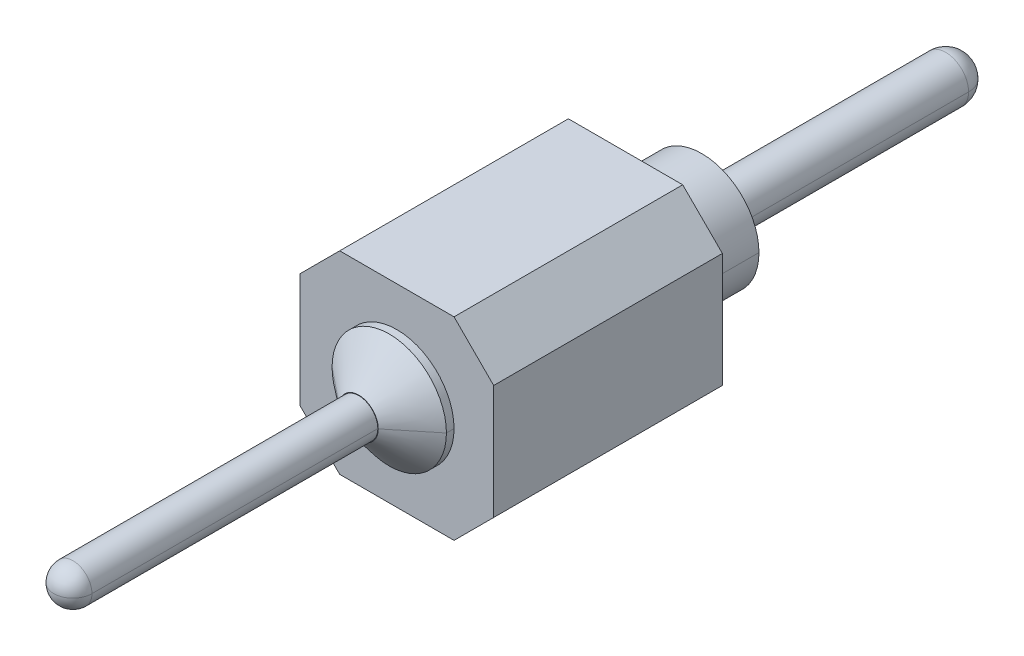
ISO-10303-21;
HEADER;
FILE_DESCRIPTION(('STEP AP214'),'2;1');
FILE_NAME('part.step','',(''),(''),'','','');
FILE_SCHEMA(('AUTOMOTIVE_DESIGN { 1 0 10303 214 1 1 1 1 }'));
ENDSEC;
DATA;
#1=APPLICATION_CONTEXT('core data for automotive mechanical design processes');
#2=APPLICATION_PROTOCOL_DEFINITION('international standard','automotive_design',2000,#1);
#3=PRODUCT_CONTEXT('',#1,'mechanical');
#4=PRODUCT('Part','Part','',(#3));
#5=PRODUCT_RELATED_PRODUCT_CATEGORY('part','',(#4));
#6=PRODUCT_DEFINITION_FORMATION('','',#4);
#7=PRODUCT_DEFINITION_CONTEXT('part definition',#1,'design');
#8=PRODUCT_DEFINITION('design','',#6,#7);
#9=PRODUCT_DEFINITION_SHAPE('','',#8);
#10=(LENGTH_UNIT() NAMED_UNIT(*) SI_UNIT(.MILLI.,.METRE.));
#11=(NAMED_UNIT(*) PLANE_ANGLE_UNIT() SI_UNIT($,.RADIAN.));
#12=(NAMED_UNIT(*) SI_UNIT($,.STERADIAN.) SOLID_ANGLE_UNIT());
#13=UNCERTAINTY_MEASURE_WITH_UNIT(LENGTH_MEASURE(1.E-05),#10,'distance_accuracy_value','');
#14=(GEOMETRIC_REPRESENTATION_CONTEXT(3) GLOBAL_UNCERTAINTY_ASSIGNED_CONTEXT((#13)) GLOBAL_UNIT_ASSIGNED_CONTEXT((#10,
#11,#12)) REPRESENTATION_CONTEXT('',''));
#15=CARTESIAN_POINT('',(0.,0.,0.));
#16=DIRECTION('',(0.,0.,1.));
#17=DIRECTION('',(1.,0.,0.));
#18=AXIS2_PLACEMENT_3D('',#15,#16,#17);
#19=CARTESIAN_POINT('',(0.,0.,0.5));
#20=DIRECTION('',(0.,0.,1.));
#21=DIRECTION('',(1.,0.,0.));
#22=AXIS2_PLACEMENT_3D('',#19,#20,#21);
#23=PLANE('',#22);
#24=CARTESIAN_POINT('',(0.,0.,0.5));
#25=DIRECTION('',(0.,0.,1.));
#26=DIRECTION('',(1.,0.,0.));
#27=AXIS2_PLACEMENT_3D('',#24,#25,#26);
#28=CIRCLE('',#27,0.256041137386);
#29=CARTESIAN_POINT('',(0.256041137386,0.,0.5));
#30=VERTEX_POINT('',#29);
#31=CARTESIAN_POINT('',(-0.256041137386,0.,0.5));
#32=VERTEX_POINT('',#31);
#33=EDGE_CURVE('E11',#30,#32,#28,.T.);
#34=ORIENTED_EDGE('',*,*,#33,.T.);
#35=CARTESIAN_POINT('',(0.,0.,0.5));
#36=DIRECTION('',(0.,0.,1.));
#37=DIRECTION('',(1.,0.,0.));
#38=AXIS2_PLACEMENT_3D('',#35,#36,#37);
#39=CIRCLE('',#38,0.256041137386);
#40=EDGE_CURVE('E263',#32,#30,#39,.T.);
#41=ORIENTED_EDGE('',*,*,#40,.T.);
#42=EDGE_LOOP('',(#34,#41));
#43=FACE_BOUND('',#42,.T.);
#44=CARTESIAN_POINT('',(0.,0.,0.5));
#45=DIRECTION('',(0.,0.,1.));
#46=DIRECTION('',(1.,0.,0.));
#47=AXIS2_PLACEMENT_3D('',#44,#45,#46);
#48=CIRCLE('',#47,0.25);
#49=CARTESIAN_POINT('',(0.25,0.,0.5));
#50=VERTEX_POINT('',#49);
#51=CARTESIAN_POINT('',(-0.25,0.,0.5));
#52=VERTEX_POINT('',#51);
#53=EDGE_CURVE('E28',#50,#52,#48,.T.);
#54=ORIENTED_EDGE('',*,*,#53,.F.);
#55=CARTESIAN_POINT('',(0.,0.,0.5));
#56=DIRECTION('',(0.,0.,1.));
#57=DIRECTION('',(1.,0.,0.));
#58=AXIS2_PLACEMENT_3D('',#55,#56,#57);
#59=CIRCLE('',#58,0.25);
#60=EDGE_CURVE('E340',#52,#50,#59,.T.);
#61=ORIENTED_EDGE('',*,*,#60,.F.);
#62=EDGE_LOOP('',(#54,#61));
#63=FACE_BOUND('',#62,.T.);
#64=ADVANCED_FACE('F17',(#43,#63),#23,.T.);
#65=CARTESIAN_POINT('',(0.,0.,0.1));
#66=DIRECTION('',(0.,0.,-1.));
#67=DIRECTION('',(1.,0.,0.));
#68=AXIS2_PLACEMENT_3D('',#65,#66,#67);
#69=CONICAL_SURFACE('',#68,0.75,0.890117918517);
#70=DIRECTION('',(-0.777145961456903,0.,-0.629320391049922));
#71=VECTOR('',#70,1.);
#72=CARTESIAN_POINT('',(-0.75,0.,0.1));
#73=LINE('',#72,#71);
#74=CARTESIAN_POINT('',(-0.75,0.,0.1));
#75=VERTEX_POINT('',#74);
#76=EDGE_CURVE('E258',#32,#75,#73,.T.);
#77=ORIENTED_EDGE('',*,*,#76,.F.);
#78=ORIENTED_EDGE('',*,*,#33,.F.);
#79=DIRECTION('',(0.777145961456903,0.,-0.629320391049922));
#80=VECTOR('',#79,1.);
#81=CARTESIAN_POINT('',(0.75,0.,0.1));
#82=LINE('',#81,#80);
#83=CARTESIAN_POINT('',(0.75,0.,0.1));
#84=VERTEX_POINT('',#83);
#85=EDGE_CURVE('E266',#30,#84,#82,.T.);
#86=ORIENTED_EDGE('',*,*,#85,.T.);
#87=CARTESIAN_POINT('',(0.,0.,0.1));
#88=DIRECTION('',(0.,0.,1.));
#89=DIRECTION('',(1.,0.,0.));
#90=AXIS2_PLACEMENT_3D('',#87,#88,#89);
#91=CIRCLE('',#90,0.75);
#92=EDGE_CURVE('E21',#84,#75,#91,.T.);
#93=ORIENTED_EDGE('',*,*,#92,.T.);
#94=EDGE_LOOP('',(#77,#78,#86,#93));
#95=FACE_BOUND('',#94,.T.);
#96=ADVANCED_FACE('F474',(#95),#69,.T.);
#97=CARTESIAN_POINT('',(0.,0.,0.5));
#98=DIRECTION('',(0.,0.,-1.));
#99=DIRECTION('',(1.,0.,0.));
#100=AXIS2_PLACEMENT_3D('',#97,#98,#99);
#101=CYLINDRICAL_SURFACE('',#100,0.25);
#102=DIRECTION('',(0.,0.,-1.));
#103=VECTOR('',#102,1.);
#104=CARTESIAN_POINT('',(-0.25,0.,0.5));
#105=LINE('',#104,#103);
#106=CARTESIAN_POINT('',(-0.25,0.,4.25));
#107=VERTEX_POINT('',#106);
#108=EDGE_CURVE('E336',#107,#52,#105,.T.);
#109=ORIENTED_EDGE('',*,*,#108,.F.);
#110=CARTESIAN_POINT('',(0.,0.,4.25));
#111=DIRECTION('',(0.,0.,1.));
#112=DIRECTION('',(1.,0.,0.));
#113=AXIS2_PLACEMENT_3D('',#110,#111,#112);
#114=CIRCLE('',#113,0.25);
#115=CARTESIAN_POINT('',(0.,0.25,4.25));
#116=VERTEX_POINT('',#115);
#117=EDGE_CURVE('E273',#116,#107,#114,.T.);
#118=ORIENTED_EDGE('',*,*,#117,.F.);
#119=CARTESIAN_POINT('',(0.,0.,4.25));
#120=DIRECTION('',(0.,0.,1.));
#121=DIRECTION('',(1.,0.,0.));
#122=AXIS2_PLACEMENT_3D('',#119,#120,#121);
#123=CIRCLE('',#122,0.25);
#124=CARTESIAN_POINT('',(0.25,0.,4.25));
#125=VERTEX_POINT('',#124);
#126=EDGE_CURVE('E278',#125,#116,#123,.T.);
#127=ORIENTED_EDGE('',*,*,#126,.F.);
#128=DIRECTION('',(0.,0.,-1.));
#129=VECTOR('',#128,1.);
#130=CARTESIAN_POINT('',(0.25,0.,0.5));
#131=LINE('',#130,#129);
#132=EDGE_CURVE('E383',#125,#50,#131,.T.);
#133=ORIENTED_EDGE('',*,*,#132,.T.);
#134=ORIENTED_EDGE('',*,*,#53,.T.);
#135=EDGE_LOOP('',(#109,#118,#127,#133,#134));
#136=FACE_BOUND('',#135,.T.);
#137=ADVANCED_FACE('F481',(#136),#101,.T.);
#138=CARTESIAN_POINT('',(0.,0.,-4.));
#139=DIRECTION('',(0.,0.,-1.));
#140=DIRECTION('',(1.,0.,0.));
#141=AXIS2_PLACEMENT_3D('',#138,#139,#140);
#142=CYLINDRICAL_SURFACE('',#141,0.75);
#143=DIRECTION('',(0.,0.,-1.));
#144=VECTOR('',#143,1.);
#145=CARTESIAN_POINT('',(-0.75,0.,-4.));
#146=LINE('',#145,#144);
#147=CARTESIAN_POINT('',(-0.75,0.,0.));
#148=VERTEX_POINT('',#147);
#149=EDGE_CURVE('E345',#75,#148,#146,.T.);
#150=ORIENTED_EDGE('',*,*,#149,.F.);
#151=ORIENTED_EDGE('',*,*,#92,.F.);
#152=DIRECTION('',(0.,0.,-1.));
#153=VECTOR('',#152,1.);
#154=CARTESIAN_POINT('',(0.75,0.,-4.));
#155=LINE('',#154,#153);
#156=CARTESIAN_POINT('',(0.75,0.,0.));
#157=VERTEX_POINT('',#156);
#158=EDGE_CURVE('E344',#84,#157,#155,.T.);
#159=ORIENTED_EDGE('',*,*,#158,.T.);
#160=CARTESIAN_POINT('',(0.,0.,0.));
#161=DIRECTION('',(0.,0.,-1.));
#162=DIRECTION('',(1.,0.,0.));
#163=AXIS2_PLACEMENT_3D('',#160,#161,#162);
#164=CIRCLE('',#163,0.75);
#165=EDGE_CURVE('E295',#148,#157,#164,.T.);
#166=ORIENTED_EDGE('',*,*,#165,.F.);
#167=EDGE_LOOP('',(#150,#151,#159,#166));
#168=FACE_BOUND('',#167,.T.);
#169=ADVANCED_FACE('F523',(#168),#142,.T.);
#170=CARTESIAN_POINT('',(0.,0.,4.25));
#171=DIRECTION('',(0.,1.,0.));
#172=DIRECTION('',(1.,0.,0.));
#173=AXIS2_PLACEMENT_3D('',#170,#171,#172);
#174=SPHERICAL_SURFACE('',#173,0.25);
#175=CARTESIAN_POINT('',(0.,0.,4.25));
#176=DIRECTION('',(0.,1.,0.));
#177=DIRECTION('',(-1.,0.,0.));
#178=AXIS2_PLACEMENT_3D('',#175,#176,#177);
#179=CIRCLE('',#178,0.25);
#180=CARTESIAN_POINT('',(0.,0.,4.5));
#181=VERTEX_POINT('',#180);
#182=EDGE_CURVE('E277',#107,#181,#179,.T.);
#183=ORIENTED_EDGE('',*,*,#182,.F.);
#184=CARTESIAN_POINT('',(0.,0.,4.25));
#185=DIRECTION('',(0.,0.,1.));
#186=DIRECTION('',(1.,0.,0.));
#187=AXIS2_PLACEMENT_3D('',#184,#185,#186);
#188=CIRCLE('',#187,0.25);
#189=CARTESIAN_POINT('',(0.,-0.25,4.25));
#190=VERTEX_POINT('',#189);
#191=EDGE_CURVE('E270',#107,#190,#188,.T.);
#192=ORIENTED_EDGE('',*,*,#191,.T.);
#193=CARTESIAN_POINT('',(0.,0.,4.25));
#194=DIRECTION('',(0.,0.,1.));
#195=DIRECTION('',(1.,0.,0.));
#196=AXIS2_PLACEMENT_3D('',#193,#194,#195);
#197=CIRCLE('',#196,0.25);
#198=EDGE_CURVE('E387',#190,#125,#197,.T.);
#199=ORIENTED_EDGE('',*,*,#198,.T.);
#200=CARTESIAN_POINT('',(0.,0.,4.25));
#201=DIRECTION('',(0.,-1.,0.));
#202=DIRECTION('',(0.,0.,-1.));
#203=AXIS2_PLACEMENT_3D('',#200,#201,#202);
#204=CIRCLE('',#203,0.25);
#205=EDGE_CURVE('E292',#125,#181,#204,.T.);
#206=ORIENTED_EDGE('',*,*,#205,.T.);
#207=EDGE_LOOP('',(#183,#192,#199,#206));
#208=FACE_BOUND('',#207,.T.);
#209=ADVANCED_FACE('F509',(#208),#174,.T.);
#210=CARTESIAN_POINT('',(0.,0.,0.));
#211=DIRECTION('',(0.,0.,1.));
#212=DIRECTION('',(1.,0.,0.));
#213=AXIS2_PLACEMENT_3D('',#210,#211,#212);
#214=PLANE('',#213);
#215=DIRECTION('',(-0.707106781186548,-0.707106781186548,0.));
#216=VECTOR('',#215,1.);
#217=CARTESIAN_POINT('',(-0.75,1.27,0.));
#218=LINE('',#217,#216);
#219=CARTESIAN_POINT('',(-0.75,1.27,0.));
#220=VERTEX_POINT('',#219);
#221=CARTESIAN_POINT('',(-1.27,0.75,0.));
#222=VERTEX_POINT('',#221);
#223=EDGE_CURVE('E42',#220,#222,#218,.T.);
#224=ORIENTED_EDGE('',*,*,#223,.T.);
#225=DIRECTION('',(0.,-1.,0.));
#226=VECTOR('',#225,1.);
#227=CARTESIAN_POINT('',(-1.27,0.75,0.));
#228=LINE('',#227,#226);
#229=CARTESIAN_POINT('',(-1.27,-0.75,0.));
#230=VERTEX_POINT('',#229);
#231=EDGE_CURVE('E74',#222,#230,#228,.T.);
#232=ORIENTED_EDGE('',*,*,#231,.T.);
#233=DIRECTION('',(0.707106781186548,-0.707106781186548,0.));
#234=VECTOR('',#233,1.);
#235=CARTESIAN_POINT('',(-1.27,-0.75,0.));
#236=LINE('',#235,#234);
#237=CARTESIAN_POINT('',(-0.75,-1.27,0.));
#238=VERTEX_POINT('',#237);
#239=EDGE_CURVE('E213',#230,#238,#236,.T.);
#240=ORIENTED_EDGE('',*,*,#239,.T.);
#241=DIRECTION('',(1.,0.,0.));
#242=VECTOR('',#241,1.);
#243=CARTESIAN_POINT('',(-0.75,-1.27,0.));
#244=LINE('',#243,#242);
#245=CARTESIAN_POINT('',(0.75,-1.27,0.));
#246=VERTEX_POINT('',#245);
#247=EDGE_CURVE('E403',#238,#246,#244,.T.);
#248=ORIENTED_EDGE('',*,*,#247,.T.);
#249=DIRECTION('',(0.707106781186548,0.707106781186548,0.));
#250=VECTOR('',#249,1.);
#251=CARTESIAN_POINT('',(0.75,-1.27,0.));
#252=LINE('',#251,#250);
#253=CARTESIAN_POINT('',(1.27,-0.75,0.));
#254=VERTEX_POINT('',#253);
#255=EDGE_CURVE('E249',#246,#254,#252,.T.);
#256=ORIENTED_EDGE('',*,*,#255,.T.);
#257=DIRECTION('',(0.,1.,0.));
#258=VECTOR('',#257,1.);
#259=CARTESIAN_POINT('',(1.27,-0.75,0.));
#260=LINE('',#259,#258);
#261=CARTESIAN_POINT('',(1.27,0.75,0.));
#262=VERTEX_POINT('',#261);
#263=EDGE_CURVE('E216',#254,#262,#260,.T.);
#264=ORIENTED_EDGE('',*,*,#263,.T.);
#265=DIRECTION('',(-0.707106781186548,0.707106781186548,0.));
#266=VECTOR('',#265,1.);
#267=CARTESIAN_POINT('',(1.27,0.75,0.));
#268=LINE('',#267,#266);
#269=CARTESIAN_POINT('',(0.75,1.27,0.));
#270=VERTEX_POINT('',#269);
#271=EDGE_CURVE('E86',#262,#270,#268,.T.);
#272=ORIENTED_EDGE('',*,*,#271,.T.);
#273=DIRECTION('',(-1.,0.,0.));
#274=VECTOR('',#273,1.);
#275=CARTESIAN_POINT('',(0.75,1.27,0.));
#276=LINE('',#275,#274);
#277=EDGE_CURVE('E256',#270,#220,#276,.T.);
#278=ORIENTED_EDGE('',*,*,#277,.T.);
#279=EDGE_LOOP('',(#224,#232,#240,#248,#256,#264,#272,#278));
#280=FACE_BOUND('',#279,.T.);
#281=CARTESIAN_POINT('',(0.,0.,0.));
#282=DIRECTION('',(0.,0.,-1.));
#283=DIRECTION('',(1.,0.,0.));
#284=AXIS2_PLACEMENT_3D('',#281,#282,#283);
#285=CIRCLE('',#284,0.75);
#286=EDGE_CURVE('E341',#157,#148,#285,.T.);
#287=ORIENTED_EDGE('',*,*,#286,.T.);
#288=ORIENTED_EDGE('',*,*,#165,.T.);
#289=EDGE_LOOP('',(#287,#288));
#290=FACE_BOUND('',#289,.T.);
#291=ADVANCED_FACE('F501',(#280,#290),#214,.T.);
#292=CARTESIAN_POINT('',(-0.75,1.27,0.));
#293=DIRECTION('',(-0.707106781186548,0.707106781186548,0.));
#294=DIRECTION('',(0.,0.,1.));
#295=AXIS2_PLACEMENT_3D('',#292,#293,#294);
#296=PLANE('',#295);
#297=DIRECTION('',(0.,0.,-1.));
#298=VECTOR('',#297,1.);
#299=CARTESIAN_POINT('',(-0.75,1.27,0.));
#300=LINE('',#299,#298);
#301=CARTESIAN_POINT('',(-0.75,1.27,-3.));
#302=VERTEX_POINT('',#301);
#303=EDGE_CURVE('E254',#220,#302,#300,.T.);
#304=ORIENTED_EDGE('',*,*,#303,.T.);
#305=DIRECTION('',(-0.707106781186548,-0.707106781186548,0.));
#306=VECTOR('',#305,1.);
#307=CARTESIAN_POINT('',(-0.75,1.27,-3.));
#308=LINE('',#307,#306);
#309=CARTESIAN_POINT('',(-1.27,0.75,-3.));
#310=VERTEX_POINT('',#309);
#311=EDGE_CURVE('E226',#302,#310,#308,.T.);
#312=ORIENTED_EDGE('',*,*,#311,.T.);
#313=DIRECTION('',(0.,0.,-1.));
#314=VECTOR('',#313,1.);
#315=CARTESIAN_POINT('',(-1.27,0.75,0.));
#316=LINE('',#315,#314);
#317=EDGE_CURVE('E221',#222,#310,#316,.T.);
#318=ORIENTED_EDGE('',*,*,#317,.F.);
#319=ORIENTED_EDGE('',*,*,#223,.F.);
#320=EDGE_LOOP('',(#304,#312,#318,#319));
#321=FACE_BOUND('',#320,.T.);
#322=ADVANCED_FACE('F499',(#321),#296,.T.);
#323=CARTESIAN_POINT('',(0.75,1.27,0.));
#324=DIRECTION('',(0.,1.,0.));
#325=DIRECTION('',(1.,0.,0.));
#326=AXIS2_PLACEMENT_3D('',#323,#324,#325);
#327=PLANE('',#326);
#328=DIRECTION('',(0.,0.,-1.));
#329=VECTOR('',#328,1.);
#330=CARTESIAN_POINT('',(0.75,1.27,0.));
#331=LINE('',#330,#329);
#332=CARTESIAN_POINT('',(0.75,1.27,-3.));
#333=VERTEX_POINT('',#332);
#334=EDGE_CURVE('E253',#270,#333,#331,.T.);
#335=ORIENTED_EDGE('',*,*,#334,.T.);
#336=DIRECTION('',(-1.,0.,0.));
#337=VECTOR('',#336,1.);
#338=CARTESIAN_POINT('',(0.75,1.27,-3.));
#339=LINE('',#338,#337);
#340=EDGE_CURVE('E285',#333,#302,#339,.T.);
#341=ORIENTED_EDGE('',*,*,#340,.T.);
#342=ORIENTED_EDGE('',*,*,#303,.F.);
#343=ORIENTED_EDGE('',*,*,#277,.F.);
#344=EDGE_LOOP('',(#335,#341,#342,#343));
#345=FACE_BOUND('',#344,.T.);
#346=ADVANCED_FACE('F498',(#345),#327,.T.);
#347=CARTESIAN_POINT('',(-1.27,0.75,0.));
#348=DIRECTION('',(-1.,0.,0.));
#349=DIRECTION('',(0.,0.,1.));
#350=AXIS2_PLACEMENT_3D('',#347,#348,#349);
#351=PLANE('',#350);
#352=ORIENTED_EDGE('',*,*,#317,.T.);
#353=DIRECTION('',(0.,-1.,0.));
#354=VECTOR('',#353,1.);
#355=CARTESIAN_POINT('',(-1.27,0.75,-3.));
#356=LINE('',#355,#354);
#357=CARTESIAN_POINT('',(-1.27,-0.75,-3.));
#358=VERTEX_POINT('',#357);
#359=EDGE_CURVE('E219',#310,#358,#356,.T.);
#360=ORIENTED_EDGE('',*,*,#359,.T.);
#361=DIRECTION('',(0.,0.,-1.));
#362=VECTOR('',#361,1.);
#363=CARTESIAN_POINT('',(-1.27,-0.75,0.));
#364=LINE('',#363,#362);
#365=EDGE_CURVE('E206',#230,#358,#364,.T.);
#366=ORIENTED_EDGE('',*,*,#365,.F.);
#367=ORIENTED_EDGE('',*,*,#231,.F.);
#368=EDGE_LOOP('',(#352,#360,#366,#367));
#369=FACE_BOUND('',#368,.T.);
#370=ADVANCED_FACE('F220',(#369),#351,.T.);
#371=CARTESIAN_POINT('',(1.27,0.75,0.));
#372=DIRECTION('',(0.707106781186548,0.707106781186548,0.));
#373=DIRECTION('',(0.,0.,-1.));
#374=AXIS2_PLACEMENT_3D('',#371,#372,#373);
#375=PLANE('',#374);
#376=DIRECTION('',(0.,0.,-1.));
#377=VECTOR('',#376,1.);
#378=CARTESIAN_POINT('',(1.27,0.75,0.));
#379=LINE('',#378,#377);
#380=CARTESIAN_POINT('',(1.27,0.75,-3.));
#381=VERTEX_POINT('',#380);
#382=EDGE_CURVE('E400',#262,#381,#379,.T.);
#383=ORIENTED_EDGE('',*,*,#382,.T.);
#384=DIRECTION('',(-0.707106781186548,0.707106781186548,0.));
#385=VECTOR('',#384,1.);
#386=CARTESIAN_POINT('',(1.27,0.75,-3.));
#387=LINE('',#386,#385);
#388=EDGE_CURVE('E331',#381,#333,#387,.T.);
#389=ORIENTED_EDGE('',*,*,#388,.T.);
#390=ORIENTED_EDGE('',*,*,#334,.F.);
#391=ORIENTED_EDGE('',*,*,#271,.F.);
#392=EDGE_LOOP('',(#383,#389,#390,#391));
#393=FACE_BOUND('',#392,.T.);
#394=ADVANCED_FACE('F497',(#393),#375,.T.);
#395=CARTESIAN_POINT('',(-1.27,-0.75,0.));
#396=DIRECTION('',(-0.707106781186548,-0.707106781186548,0.));
#397=DIRECTION('',(-0.707106781186548,0.707106781186548,0.));
#398=AXIS2_PLACEMENT_3D('',#395,#396,#397);
#399=PLANE('',#398);
#400=ORIENTED_EDGE('',*,*,#365,.T.);
#401=DIRECTION('',(0.707106781186548,-0.707106781186548,0.));
#402=VECTOR('',#401,1.);
#403=CARTESIAN_POINT('',(-1.27,-0.75,-3.));
#404=LINE('',#403,#402);
#405=CARTESIAN_POINT('',(-0.75,-1.27,-3.));
#406=VERTEX_POINT('',#405);
#407=EDGE_CURVE('E211',#358,#406,#404,.T.);
#408=ORIENTED_EDGE('',*,*,#407,.T.);
#409=DIRECTION('',(0.,0.,-1.));
#410=VECTOR('',#409,1.);
#411=CARTESIAN_POINT('',(-0.75,-1.27,0.));
#412=LINE('',#411,#410);
#413=EDGE_CURVE('E322',#238,#406,#412,.T.);
#414=ORIENTED_EDGE('',*,*,#413,.F.);
#415=ORIENTED_EDGE('',*,*,#239,.F.);
#416=EDGE_LOOP('',(#400,#408,#414,#415));
#417=FACE_BOUND('',#416,.T.);
#418=ADVANCED_FACE('F208',(#417),#399,.T.);
#419=CARTESIAN_POINT('',(1.27,-0.75,0.));
#420=DIRECTION('',(1.,0.,0.));
#421=DIRECTION('',(0.,1.,0.));
#422=AXIS2_PLACEMENT_3D('',#419,#420,#421);
#423=PLANE('',#422);
#424=DIRECTION('',(0.,0.,-1.));
#425=VECTOR('',#424,1.);
#426=CARTESIAN_POINT('',(1.27,-0.75,0.));
#427=LINE('',#426,#425);
#428=CARTESIAN_POINT('',(1.27,-0.75,-3.));
#429=VERTEX_POINT('',#428);
#430=EDGE_CURVE('E246',#254,#429,#427,.T.);
#431=ORIENTED_EDGE('',*,*,#430,.T.);
#432=DIRECTION('',(0.,1.,0.));
#433=VECTOR('',#432,1.);
#434=CARTESIAN_POINT('',(1.27,-0.75,-3.));
#435=LINE('',#434,#433);
#436=EDGE_CURVE('E325',#429,#381,#435,.T.);
#437=ORIENTED_EDGE('',*,*,#436,.T.);
#438=ORIENTED_EDGE('',*,*,#382,.F.);
#439=ORIENTED_EDGE('',*,*,#263,.F.);
#440=EDGE_LOOP('',(#431,#437,#438,#439));
#441=FACE_BOUND('',#440,.T.);
#442=ADVANCED_FACE('F515',(#441),#423,.T.);
#443=CARTESIAN_POINT('',(-0.75,-1.27,0.));
#444=DIRECTION('',(0.,-1.,0.));
#445=DIRECTION('',(0.,0.,-1.));
#446=AXIS2_PLACEMENT_3D('',#443,#444,#445);
#447=PLANE('',#446);
#448=ORIENTED_EDGE('',*,*,#413,.T.);
#449=DIRECTION('',(1.,0.,0.));
#450=VECTOR('',#449,1.);
#451=CARTESIAN_POINT('',(-0.75,-1.27,-3.));
#452=LINE('',#451,#450);
#453=CARTESIAN_POINT('',(0.75,-1.27,-3.));
#454=VERTEX_POINT('',#453);
#455=EDGE_CURVE('E233',#406,#454,#452,.T.);
#456=ORIENTED_EDGE('',*,*,#455,.T.);
#457=DIRECTION('',(0.,0.,-1.));
#458=VECTOR('',#457,1.);
#459=CARTESIAN_POINT('',(0.75,-1.27,0.));
#460=LINE('',#459,#458);
#461=EDGE_CURVE('E250',#246,#454,#460,.T.);
#462=ORIENTED_EDGE('',*,*,#461,.F.);
#463=ORIENTED_EDGE('',*,*,#247,.F.);
#464=EDGE_LOOP('',(#448,#456,#462,#463));
#465=FACE_BOUND('',#464,.T.);
#466=ADVANCED_FACE('F19',(#465),#447,.T.);
#467=CARTESIAN_POINT('',(0.75,-1.27,0.));
#468=DIRECTION('',(0.707106781186548,-0.707106781186548,0.));
#469=DIRECTION('',(0.,0.,-1.));
#470=AXIS2_PLACEMENT_3D('',#467,#468,#469);
#471=PLANE('',#470);
#472=ORIENTED_EDGE('',*,*,#461,.T.);
#473=DIRECTION('',(0.707106781186548,0.707106781186548,0.));
#474=VECTOR('',#473,1.);
#475=CARTESIAN_POINT('',(0.75,-1.27,-3.));
#476=LINE('',#475,#474);
#477=EDGE_CURVE('E240',#454,#429,#476,.T.);
#478=ORIENTED_EDGE('',*,*,#477,.T.);
#479=ORIENTED_EDGE('',*,*,#430,.F.);
#480=ORIENTED_EDGE('',*,*,#255,.F.);
#481=EDGE_LOOP('',(#472,#478,#479,#480));
#482=FACE_BOUND('',#481,.T.);
#483=ADVANCED_FACE('F316',(#482),#471,.T.);
#484=CARTESIAN_POINT('',(0.,0.,-3.));
#485=DIRECTION('',(0.,0.,1.));
#486=DIRECTION('',(1.,0.,0.));
#487=AXIS2_PLACEMENT_3D('',#484,#485,#486);
#488=PLANE('',#487);
#489=ORIENTED_EDGE('',*,*,#340,.F.);
#490=ORIENTED_EDGE('',*,*,#388,.F.);
#491=ORIENTED_EDGE('',*,*,#436,.F.);
#492=ORIENTED_EDGE('',*,*,#477,.F.);
#493=ORIENTED_EDGE('',*,*,#455,.F.);
#494=ORIENTED_EDGE('',*,*,#407,.F.);
#495=ORIENTED_EDGE('',*,*,#359,.F.);
#496=ORIENTED_EDGE('',*,*,#311,.F.);
#497=EDGE_LOOP('',(#489,#490,#491,#492,#493,#494,#495,#496));
#498=FACE_BOUND('',#497,.T.);
#499=CARTESIAN_POINT('',(0.,0.,-3.));
#500=DIRECTION('',(0.,0.,-1.));
#501=DIRECTION('',(1.,0.,0.));
#502=AXIS2_PLACEMENT_3D('',#499,#500,#501);
#503=CIRCLE('',#502,0.75);
#504=CARTESIAN_POINT('',(0.75,0.,-3.));
#505=VERTEX_POINT('',#504);
#506=CARTESIAN_POINT('',(-0.75,0.,-3.));
#507=VERTEX_POINT('',#506);
#508=EDGE_CURVE('E287',#505,#507,#503,.T.);
#509=ORIENTED_EDGE('',*,*,#508,.F.);
#510=CARTESIAN_POINT('',(0.,0.,-3.));
#511=DIRECTION('',(0.,0.,-1.));
#512=DIRECTION('',(1.,0.,0.));
#513=AXIS2_PLACEMENT_3D('',#510,#511,#512);
#514=CIRCLE('',#513,0.75);
#515=EDGE_CURVE('E281',#507,#505,#514,.T.);
#516=ORIENTED_EDGE('',*,*,#515,.F.);
#517=EDGE_LOOP('',(#509,#516));
#518=FACE_BOUND('',#517,.T.);
#519=ADVANCED_FACE('F229',(#498,#518),#488,.F.);
#520=CARTESIAN_POINT('',(0.,0.,-4.));
#521=DIRECTION('',(0.,0.,-1.));
#522=DIRECTION('',(1.,0.,0.));
#523=AXIS2_PLACEMENT_3D('',#520,#521,#522);
#524=CYLINDRICAL_SURFACE('',#523,0.75);
#525=DIRECTION('',(0.,0.,-1.));
#526=VECTOR('',#525,1.);
#527=CARTESIAN_POINT('',(-0.75,0.,-4.));
#528=LINE('',#527,#526);
#529=CARTESIAN_POINT('',(-0.75,0.,-4.));
#530=VERTEX_POINT('',#529);
#531=EDGE_CURVE('E291',#507,#530,#528,.T.);
#532=ORIENTED_EDGE('',*,*,#531,.F.);
#533=ORIENTED_EDGE('',*,*,#515,.T.);
#534=DIRECTION('',(0.,0.,-1.));
#535=VECTOR('',#534,1.);
#536=CARTESIAN_POINT('',(0.75,0.,-4.));
#537=LINE('',#536,#535);
#538=CARTESIAN_POINT('',(0.75,0.,-4.));
#539=VERTEX_POINT('',#538);
#540=EDGE_CURVE('E303',#505,#539,#537,.T.);
#541=ORIENTED_EDGE('',*,*,#540,.T.);
#542=CARTESIAN_POINT('',(0.,0.,-4.));
#543=DIRECTION('',(0.,0.,1.));
#544=DIRECTION('',(1.,0.,0.));
#545=AXIS2_PLACEMENT_3D('',#542,#543,#544);
#546=CIRCLE('',#545,0.75);
#547=EDGE_CURVE('E286',#539,#530,#546,.T.);
#548=ORIENTED_EDGE('',*,*,#547,.T.);
#549=EDGE_LOOP('',(#532,#533,#541,#548));
#550=FACE_BOUND('',#549,.T.);
#551=ADVANCED_FACE('F614',(#550),#524,.T.);
#552=CARTESIAN_POINT('',(0.,0.,-4.));
#553=DIRECTION('',(0.,0.,1.));
#554=DIRECTION('',(1.,0.,0.));
#555=AXIS2_PLACEMENT_3D('',#552,#553,#554);
#556=PLANE('',#555);
#557=ORIENTED_EDGE('',*,*,#547,.F.);
#558=CARTESIAN_POINT('',(0.,0.,-4.));
#559=DIRECTION('',(0.,0.,1.));
#560=DIRECTION('',(1.,0.,0.));
#561=AXIS2_PLACEMENT_3D('',#558,#559,#560);
#562=CIRCLE('',#561,0.75);
#563=EDGE_CURVE('E363',#530,#539,#562,.T.);
#564=ORIENTED_EDGE('',*,*,#563,.F.);
#565=EDGE_LOOP('',(#557,#564));
#566=FACE_BOUND('',#565,.T.);
#567=CARTESIAN_POINT('',(0.,0.,-4.));
#568=DIRECTION('',(0.,0.,1.));
#569=DIRECTION('',(1.,0.,0.));
#570=AXIS2_PLACEMENT_3D('',#567,#568,#569);
#571=CIRCLE('',#570,0.3);
#572=CARTESIAN_POINT('',(0.3,0.,-4.));
#573=VERTEX_POINT('',#572);
#574=CARTESIAN_POINT('',(-0.3,0.,-4.));
#575=VERTEX_POINT('',#574);
#576=EDGE_CURVE('E308',#573,#575,#571,.T.);
#577=ORIENTED_EDGE('',*,*,#576,.T.);
#578=CARTESIAN_POINT('',(0.,0.,-4.));
#579=DIRECTION('',(0.,0.,1.));
#580=DIRECTION('',(1.,0.,0.));
#581=AXIS2_PLACEMENT_3D('',#578,#579,#580);
#582=CIRCLE('',#581,0.3);
#583=EDGE_CURVE('E425',#575,#573,#582,.T.);
#584=ORIENTED_EDGE('',*,*,#583,.T.);
#585=EDGE_LOOP('',(#577,#584));
#586=FACE_BOUND('',#585,.T.);
#587=ADVANCED_FACE('F448',(#566,#586),#556,.F.);
#588=CARTESIAN_POINT('',(0.,0.,-4.));
#589=DIRECTION('',(0.,0.,1.));
#590=DIRECTION('',(1.,0.,0.));
#591=AXIS2_PLACEMENT_3D('',#588,#589,#590);
#592=CYLINDRICAL_SURFACE('',#591,0.3);
#593=DIRECTION('',(0.,0.,1.));
#594=VECTOR('',#593,1.);
#595=CARTESIAN_POINT('',(-0.3,0.,-4.));
#596=LINE('',#595,#594);
#597=CARTESIAN_POINT('',(-0.3,0.,-7.2));
#598=VERTEX_POINT('',#597);
#599=EDGE_CURVE('E302',#598,#575,#596,.T.);
#600=ORIENTED_EDGE('',*,*,#599,.F.);
#601=CARTESIAN_POINT('',(0.,0.,-7.2));
#602=DIRECTION('',(0.,0.,1.));
#603=DIRECTION('',(1.,0.,0.));
#604=AXIS2_PLACEMENT_3D('',#601,#602,#603);
#605=CIRCLE('',#604,0.3);
#606=CARTESIAN_POINT('',(0.,-0.3,-7.2));
#607=VERTEX_POINT('',#606);
#608=EDGE_CURVE('E244',#598,#607,#605,.T.);
#609=ORIENTED_EDGE('',*,*,#608,.T.);
#610=CARTESIAN_POINT('',(0.,0.,-7.2));
#611=DIRECTION('',(0.,0.,1.));
#612=DIRECTION('',(1.,0.,0.));
#613=AXIS2_PLACEMENT_3D('',#610,#611,#612);
#614=CIRCLE('',#613,0.3);
#615=CARTESIAN_POINT('',(0.3,0.,-7.2));
#616=VERTEX_POINT('',#615);
#617=EDGE_CURVE('E435',#607,#616,#614,.T.);
#618=ORIENTED_EDGE('',*,*,#617,.T.);
#619=DIRECTION('',(0.,0.,1.));
#620=VECTOR('',#619,1.);
#621=CARTESIAN_POINT('',(0.3,0.,-4.));
#622=LINE('',#621,#620);
#623=EDGE_CURVE('E304',#616,#573,#622,.T.);
#624=ORIENTED_EDGE('',*,*,#623,.T.);
#625=ORIENTED_EDGE('',*,*,#583,.F.);
#626=EDGE_LOOP('',(#600,#609,#618,#624,#625));
#627=FACE_BOUND('',#626,.T.);
#628=ADVANCED_FACE('F451',(#627),#592,.T.);
#629=CARTESIAN_POINT('',(0.,0.,-7.2));
#630=DIRECTION('',(0.,-1.,0.));
#631=DIRECTION('',(1.,0.,0.));
#632=AXIS2_PLACEMENT_3D('',#629,#630,#631);
#633=SPHERICAL_SURFACE('',#632,0.3);
#634=CARTESIAN_POINT('',(0.,0.,-7.2));
#635=DIRECTION('',(0.,-1.,0.));
#636=DIRECTION('',(1.,0.,0.));
#637=AXIS2_PLACEMENT_3D('',#634,#635,#636);
#638=CIRCLE('',#637,0.3);
#639=CARTESIAN_POINT('',(0.,0.,-7.5));
#640=VERTEX_POINT('',#639);
#641=EDGE_CURVE('E418',#598,#640,#638,.T.);
#642=ORIENTED_EDGE('',*,*,#641,.F.);
#643=CARTESIAN_POINT('',(0.,0.,-7.2));
#644=DIRECTION('',(0.,0.,1.));
#645=DIRECTION('',(1.,0.,0.));
#646=AXIS2_PLACEMENT_3D('',#643,#644,#645);
#647=CIRCLE('',#646,0.3);
#648=CARTESIAN_POINT('',(0.,0.3,-7.2));
#649=VERTEX_POINT('',#648);
#650=EDGE_CURVE('E298',#649,#598,#647,.T.);
#651=ORIENTED_EDGE('',*,*,#650,.F.);
#652=CARTESIAN_POINT('',(0.,0.,-7.2));
#653=DIRECTION('',(0.,0.,1.));
#654=DIRECTION('',(1.,0.,0.));
#655=AXIS2_PLACEMENT_3D('',#652,#653,#654);
#656=CIRCLE('',#655,0.3);
#657=EDGE_CURVE('E307',#616,#649,#656,.T.);
#658=ORIENTED_EDGE('',*,*,#657,.F.);
#659=CARTESIAN_POINT('',(0.,0.,-7.2));
#660=DIRECTION('',(0.,1.,0.));
#661=DIRECTION('',(0.,0.,1.));
#662=AXIS2_PLACEMENT_3D('',#659,#660,#661);
#663=CIRCLE('',#662,0.3);
#664=EDGE_CURVE('E422',#616,#640,#663,.T.);
#665=ORIENTED_EDGE('',*,*,#664,.T.);
#666=EDGE_LOOP('',(#642,#651,#658,#665));
#667=FACE_BOUND('',#666,.T.);
#668=ADVANCED_FACE('F468',(#667),#633,.T.);
#669=CARTESIAN_POINT('',(0.,0.,-7.2));
#670=DIRECTION('',(0.,-1.,0.));
#671=DIRECTION('',(1.,0.,0.));
#672=AXIS2_PLACEMENT_3D('',#669,#670,#671);
#673=SPHERICAL_SURFACE('',#672,0.3);
#674=ORIENTED_EDGE('',*,*,#617,.F.);
#675=ORIENTED_EDGE('',*,*,#608,.F.);
#676=ORIENTED_EDGE('',*,*,#641,.T.);
#677=ORIENTED_EDGE('',*,*,#664,.F.);
#678=EDGE_LOOP('',(#674,#675,#676,#677));
#679=FACE_BOUND('',#678,.T.);
#680=ADVANCED_FACE('F458',(#679),#673,.T.);
#681=CARTESIAN_POINT('',(0.,0.,-4.));
#682=DIRECTION('',(0.,0.,1.));
#683=DIRECTION('',(1.,0.,0.));
#684=AXIS2_PLACEMENT_3D('',#681,#682,#683);
#685=CYLINDRICAL_SURFACE('',#684,0.3);
#686=ORIENTED_EDGE('',*,*,#650,.T.);
#687=ORIENTED_EDGE('',*,*,#599,.T.);
#688=ORIENTED_EDGE('',*,*,#576,.F.);
#689=ORIENTED_EDGE('',*,*,#623,.F.);
#690=ORIENTED_EDGE('',*,*,#657,.T.);
#691=EDGE_LOOP('',(#686,#687,#688,#689,#690));
#692=FACE_BOUND('',#691,.T.);
#693=ADVANCED_FACE('F454',(#692),#685,.T.);
#694=CARTESIAN_POINT('',(0.,0.,-4.));
#695=DIRECTION('',(0.,0.,-1.));
#696=DIRECTION('',(1.,0.,0.));
#697=AXIS2_PLACEMENT_3D('',#694,#695,#696);
#698=CYLINDRICAL_SURFACE('',#697,0.75);
#699=ORIENTED_EDGE('',*,*,#508,.T.);
#700=ORIENTED_EDGE('',*,*,#531,.T.);
#701=ORIENTED_EDGE('',*,*,#563,.T.);
#702=ORIENTED_EDGE('',*,*,#540,.F.);
#703=EDGE_LOOP('',(#699,#700,#701,#702));
#704=FACE_BOUND('',#703,.T.);
#705=ADVANCED_FACE('F457',(#704),#698,.T.);
#706=CARTESIAN_POINT('',(0.,0.,4.25));
#707=DIRECTION('',(0.,1.,0.));
#708=DIRECTION('',(1.,0.,0.));
#709=AXIS2_PLACEMENT_3D('',#706,#707,#708);
#710=SPHERICAL_SURFACE('',#709,0.25);
#711=ORIENTED_EDGE('',*,*,#126,.T.);
#712=ORIENTED_EDGE('',*,*,#117,.T.);
#713=ORIENTED_EDGE('',*,*,#182,.T.);
#714=ORIENTED_EDGE('',*,*,#205,.F.);
#715=EDGE_LOOP('',(#711,#712,#713,#714));
#716=FACE_BOUND('',#715,.T.);
#717=ADVANCED_FACE('F466',(#716),#710,.T.);
#718=CARTESIAN_POINT('',(0.,0.,-4.));
#719=DIRECTION('',(0.,0.,-1.));
#720=DIRECTION('',(1.,0.,0.));
#721=AXIS2_PLACEMENT_3D('',#718,#719,#720);
#722=CYLINDRICAL_SURFACE('',#721,0.75);
#723=CARTESIAN_POINT('',(0.,0.,0.1));
#724=DIRECTION('',(0.,0.,1.));
#725=DIRECTION('',(1.,0.,0.));
#726=AXIS2_PLACEMENT_3D('',#723,#724,#725);
#727=CIRCLE('',#726,0.75);
#728=EDGE_CURVE('E262',#75,#84,#727,.T.);
#729=ORIENTED_EDGE('',*,*,#728,.F.);
#730=ORIENTED_EDGE('',*,*,#149,.T.);
#731=ORIENTED_EDGE('',*,*,#286,.F.);
#732=ORIENTED_EDGE('',*,*,#158,.F.);
#733=EDGE_LOOP('',(#729,#730,#731,#732));
#734=FACE_BOUND('',#733,.T.);
#735=ADVANCED_FACE('F494',(#734),#722,.T.);
#736=CARTESIAN_POINT('',(0.,0.,0.5));
#737=DIRECTION('',(0.,0.,-1.));
#738=DIRECTION('',(1.,0.,0.));
#739=AXIS2_PLACEMENT_3D('',#736,#737,#738);
#740=CYLINDRICAL_SURFACE('',#739,0.25);
#741=ORIENTED_EDGE('',*,*,#191,.F.);
#742=ORIENTED_EDGE('',*,*,#108,.T.);
#743=ORIENTED_EDGE('',*,*,#60,.T.);
#744=ORIENTED_EDGE('',*,*,#132,.F.);
#745=ORIENTED_EDGE('',*,*,#198,.F.);
#746=EDGE_LOOP('',(#741,#742,#743,#744,#745));
#747=FACE_BOUND('',#746,.T.);
#748=ADVANCED_FACE('F530',(#747),#740,.T.);
#749=CARTESIAN_POINT('',(0.,0.,0.1));
#750=DIRECTION('',(0.,0.,-1.));
#751=DIRECTION('',(1.,0.,0.));
#752=AXIS2_PLACEMENT_3D('',#749,#750,#751);
#753=CONICAL_SURFACE('',#752,0.75,0.890117918517);
#754=ORIENTED_EDGE('',*,*,#40,.F.);
#755=ORIENTED_EDGE('',*,*,#76,.T.);
#756=ORIENTED_EDGE('',*,*,#728,.T.);
#757=ORIENTED_EDGE('',*,*,#85,.F.);
#758=EDGE_LOOP('',(#754,#755,#756,#757));
#759=FACE_BOUND('',#758,.T.);
#760=ADVANCED_FACE('F528',(#759),#753,.T.);
#761=CLOSED_SHELL('',(#64,#96,#137,#169,#209,#291,#322,#346,#370,#394,#418,#442,#466,#483,#519,
#551,#587,#628,#668,#680,#693,#705,#717,#735,#748,#760));
#762=MANIFOLD_SOLID_BREP('B1',#761);
#763=ADVANCED_BREP_SHAPE_REPRESENTATION('',(#18,#762),#14);
#764=SHAPE_DEFINITION_REPRESENTATION(#9,#763);
ENDSEC;
END-ISO-10303-21;
